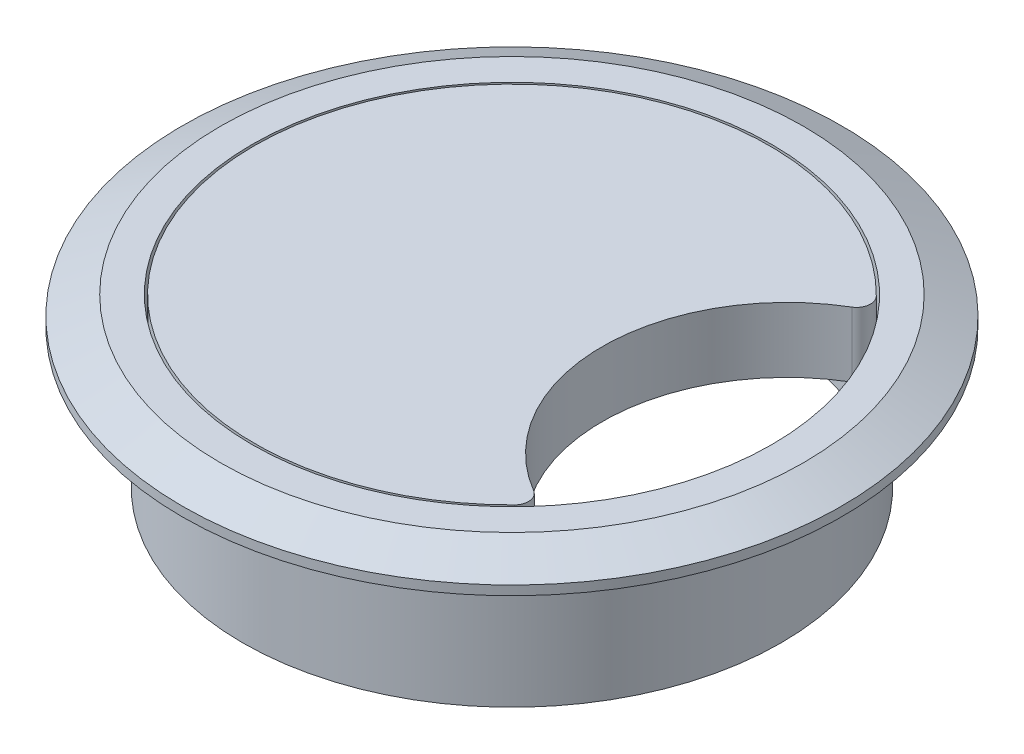
ISO-10303-21;
HEADER;
FILE_DESCRIPTION(('STEP AP214'),'2;1');
FILE_NAME('part.step','',(''),(''),'','','');
FILE_SCHEMA(('AUTOMOTIVE_DESIGN { 1 0 10303 214 1 1 1 1 }'));
ENDSEC;
DATA;
#1=APPLICATION_CONTEXT('core data for automotive mechanical design processes');
#2=APPLICATION_PROTOCOL_DEFINITION('international standard','automotive_design',2000,#1);
#3=PRODUCT_CONTEXT('',#1,'mechanical');
#4=PRODUCT('Part','Part','',(#3));
#5=PRODUCT_RELATED_PRODUCT_CATEGORY('part','',(#4));
#6=PRODUCT_DEFINITION_FORMATION('','',#4);
#7=PRODUCT_DEFINITION_CONTEXT('part definition',#1,'design');
#8=PRODUCT_DEFINITION('design','',#6,#7);
#9=PRODUCT_DEFINITION_SHAPE('','',#8);
#10=(LENGTH_UNIT() NAMED_UNIT(*) SI_UNIT(.MILLI.,.METRE.));
#11=(NAMED_UNIT(*) PLANE_ANGLE_UNIT() SI_UNIT($,.RADIAN.));
#12=(NAMED_UNIT(*) SI_UNIT($,.STERADIAN.) SOLID_ANGLE_UNIT());
#13=UNCERTAINTY_MEASURE_WITH_UNIT(LENGTH_MEASURE(1.E-05),#10,'distance_accuracy_value','');
#14=(GEOMETRIC_REPRESENTATION_CONTEXT(3) GLOBAL_UNCERTAINTY_ASSIGNED_CONTEXT((#13)) GLOBAL_UNIT_ASSIGNED_CONTEXT((#10,
#11,#12)) REPRESENTATION_CONTEXT('',''));
#15=CARTESIAN_POINT('',(0.,0.,0.));
#16=DIRECTION('',(0.,0.,1.));
#17=DIRECTION('',(1.,0.,0.));
#18=AXIS2_PLACEMENT_3D('',#15,#16,#17);
#19=CARTESIAN_POINT('',(29.6411049278792,-4.,0.));
#20=DIRECTION('',(0.,1.,0.));
#21=DIRECTION('',(0.,0.,1.));
#22=AXIS2_PLACEMENT_3D('',#19,#20,#21);
#23=CYLINDRICAL_SURFACE('',#22,19.9235046836858);
#24=CARTESIAN_POINT('',(29.6411049278792,3.,0.));
#25=DIRECTION('',(0.,-1.,0.));
#26=DIRECTION('',(0.,0.,1.));
#27=AXIS2_PLACEMENT_3D('',#24,#25,#26);
#28=CIRCLE('',#27,19.9235046836858);
#29=CARTESIAN_POINT('',(19.472018789832,3.,17.1328843455452));
#30=VERTEX_POINT('',#29);
#31=CARTESIAN_POINT('',(19.4720187898321,3.,-17.1328843455452));
#32=VERTEX_POINT('',#31);
#33=EDGE_CURVE('E85',#30,#32,#28,.T.);
#34=ORIENTED_EDGE('',*,*,#33,.F.);
#35=DIRECTION('',(0.,1.,0.));
#36=VECTOR('',#35,1.);
#37=CARTESIAN_POINT('',(19.472018789832,-4.,17.1328843455452));
#38=LINE('',#37,#36);
#39=CARTESIAN_POINT('',(19.472018789832,-4.,17.1328843455452));
#40=VERTEX_POINT('',#39);
#41=EDGE_CURVE('E61',#30,#40,#38,.F.);
#42=ORIENTED_EDGE('',*,*,#41,.T.);
#43=CARTESIAN_POINT('',(29.6411049278792,-4.,0.));
#44=DIRECTION('',(0.,-1.,0.));
#45=DIRECTION('',(0.,0.,1.));
#46=AXIS2_PLACEMENT_3D('',#43,#44,#45);
#47=CIRCLE('',#46,19.9235046836858);
#48=CARTESIAN_POINT('',(19.4720187898321,-4.,-17.1328843455452));
#49=VERTEX_POINT('',#48);
#50=EDGE_CURVE('E99',#40,#49,#47,.T.);
#51=ORIENTED_EDGE('',*,*,#50,.T.);
#52=DIRECTION('',(0.,1.,0.));
#53=VECTOR('',#52,1.);
#54=CARTESIAN_POINT('',(19.4720187898321,-4.,-17.1328843455452));
#55=LINE('',#54,#53);
#56=EDGE_CURVE('E108',#49,#32,#55,.T.);
#57=ORIENTED_EDGE('',*,*,#56,.T.);
#58=EDGE_LOOP('',(#34,#42,#51,#57));
#59=FACE_BOUND('',#58,.T.);
#60=ADVANCED_FACE('F40',(#59),#23,.F.);
#61=CARTESIAN_POINT('',(0.,-4.,0.));
#62=DIRECTION('',(0.,1.,0.));
#63=DIRECTION('',(0.,0.,1.));
#64=AXIS2_PLACEMENT_3D('',#61,#62,#63);
#65=CYLINDRICAL_SURFACE('',#64,27.7550703412964);
#66=CARTESIAN_POINT('',(0.,-4.,0.));
#67=DIRECTION('',(0.,1.,0.));
#68=DIRECTION('',(0.,0.,1.));
#69=AXIS2_PLACEMENT_3D('',#66,#67,#68);
#70=CIRCLE('',#69,27.7550703412964);
#71=CARTESIAN_POINT('',(19.7751402799119,-4.,-19.4753114624674));
#72=VERTEX_POINT('',#71);
#73=CARTESIAN_POINT('',(19.7751402799119,-4.,19.4753114624674));
#74=VERTEX_POINT('',#73);
#75=EDGE_CURVE('E101',#72,#74,#70,.T.);
#76=ORIENTED_EDGE('',*,*,#75,.T.);
#77=DIRECTION('',(0.,1.,0.));
#78=VECTOR('',#77,1.);
#79=CARTESIAN_POINT('',(19.7751402799119,-4.,19.4753114624674));
#80=LINE('',#79,#78);
#81=CARTESIAN_POINT('',(19.7751402799119,3.,19.4753114624674));
#82=VERTEX_POINT('',#81);
#83=EDGE_CURVE('E91',#74,#82,#80,.T.);
#84=ORIENTED_EDGE('',*,*,#83,.T.);
#85=CARTESIAN_POINT('',(0.,3.,0.));
#86=DIRECTION('',(0.,1.,0.));
#87=DIRECTION('',(0.,0.,1.));
#88=AXIS2_PLACEMENT_3D('',#85,#86,#87);
#89=CIRCLE('',#88,27.7550703412964);
#90=CARTESIAN_POINT('',(19.7751402799119,3.,-19.4753114624674));
#91=VERTEX_POINT('',#90);
#92=EDGE_CURVE('E84',#91,#82,#89,.T.);
#93=ORIENTED_EDGE('',*,*,#92,.F.);
#94=DIRECTION('',(0.,1.,0.));
#95=VECTOR('',#94,1.);
#96=CARTESIAN_POINT('',(19.7751402799119,-4.,-19.4753114624674));
#97=LINE('',#96,#95);
#98=EDGE_CURVE('E97',#91,#72,#97,.F.);
#99=ORIENTED_EDGE('',*,*,#98,.T.);
#100=EDGE_LOOP('',(#76,#84,#93,#99));
#101=FACE_BOUND('',#100,.T.);
#102=ADVANCED_FACE('F96',(#101),#65,.T.);
#103=CARTESIAN_POINT('',(14.8205524639396,-4.,0.));
#104=DIRECTION('',(0.,1.,0.));
#105=DIRECTION('',(0.,0.,1.));
#106=AXIS2_PLACEMENT_3D('',#103,#104,#105);
#107=PLANE('',#106);
#108=ORIENTED_EDGE('',*,*,#50,.F.);
#109=CARTESIAN_POINT('',(18.7064090515233,-4.,18.4227842364695));
#110=DIRECTION('',(0.,1.,0.));
#111=DIRECTION('',(0.,0.,1.));
#112=AXIS2_PLACEMENT_3D('',#109,#110,#111);
#113=CIRCLE('',#112,1.5);
#114=EDGE_CURVE('E12',#40,#74,#113,.F.);
#115=ORIENTED_EDGE('',*,*,#114,.T.);
#116=ORIENTED_EDGE('',*,*,#75,.F.);
#117=CARTESIAN_POINT('',(18.7064090515233,-4.,-18.4227842364695));
#118=DIRECTION('',(0.,1.,0.));
#119=DIRECTION('',(0.,0.,1.));
#120=AXIS2_PLACEMENT_3D('',#117,#118,#119);
#121=CIRCLE('',#120,1.5);
#122=EDGE_CURVE('E48',#72,#49,#121,.F.);
#123=ORIENTED_EDGE('',*,*,#122,.T.);
#124=EDGE_LOOP('',(#108,#115,#116,#123));
#125=FACE_BOUND('',#124,.T.);
#126=ADVANCED_FACE('F112',(#125),#107,.F.);
#127=CARTESIAN_POINT('',(14.8205524639396,3.,0.));
#128=DIRECTION('',(0.,1.,0.));
#129=DIRECTION('',(0.,0.,1.));
#130=AXIS2_PLACEMENT_3D('',#127,#128,#129);
#131=PLANE('',#130);
#132=ORIENTED_EDGE('',*,*,#92,.T.);
#133=CARTESIAN_POINT('',(18.7064090515233,3.,18.4227842364695));
#134=DIRECTION('',(0.,1.,0.));
#135=DIRECTION('',(0.,0.,1.));
#136=AXIS2_PLACEMENT_3D('',#133,#134,#135);
#137=CIRCLE('',#136,1.5);
#138=EDGE_CURVE('E90',#82,#30,#137,.T.);
#139=ORIENTED_EDGE('',*,*,#138,.T.);
#140=ORIENTED_EDGE('',*,*,#33,.T.);
#141=CARTESIAN_POINT('',(18.7064090515233,3.,-18.4227842364695));
#142=DIRECTION('',(0.,1.,0.));
#143=DIRECTION('',(0.,0.,1.));
#144=AXIS2_PLACEMENT_3D('',#141,#142,#143);
#145=CIRCLE('',#144,1.5);
#146=EDGE_CURVE('E81',#32,#91,#145,.T.);
#147=ORIENTED_EDGE('',*,*,#146,.T.);
#148=EDGE_LOOP('',(#132,#139,#140,#147));
#149=FACE_BOUND('',#148,.T.);
#150=ADVANCED_FACE('F83',(#149),#131,.T.);
#151=CARTESIAN_POINT('',(18.7064090515233,-4.,18.4227842364695));
#152=DIRECTION('',(0.,-1.,0.));
#153=DIRECTION('',(0.,0.,-1.));
#154=AXIS2_PLACEMENT_3D('',#151,#152,#153);
#155=CYLINDRICAL_SURFACE('',#154,1.5);
#156=ORIENTED_EDGE('',*,*,#114,.F.);
#157=ORIENTED_EDGE('',*,*,#41,.F.);
#158=ORIENTED_EDGE('',*,*,#138,.F.);
#159=ORIENTED_EDGE('',*,*,#83,.F.);
#160=EDGE_LOOP('',(#156,#157,#158,#159));
#161=FACE_BOUND('',#160,.T.);
#162=ADVANCED_FACE('F114',(#161),#155,.T.);
#163=CARTESIAN_POINT('',(18.7064090515233,-4.,-18.4227842364695));
#164=DIRECTION('',(0.,-1.,0.));
#165=DIRECTION('',(0.,0.,-1.));
#166=AXIS2_PLACEMENT_3D('',#163,#164,#165);
#167=CYLINDRICAL_SURFACE('',#166,1.5);
#168=ORIENTED_EDGE('',*,*,#122,.F.);
#169=ORIENTED_EDGE('',*,*,#98,.F.);
#170=ORIENTED_EDGE('',*,*,#146,.F.);
#171=ORIENTED_EDGE('',*,*,#56,.F.);
#172=EDGE_LOOP('',(#168,#169,#170,#171));
#173=FACE_BOUND('',#172,.T.);
#174=ADVANCED_FACE('F42',(#173),#167,.T.);
#175=CLOSED_SHELL('',(#60,#102,#126,#150,#162,#174));
#176=MANIFOLD_SOLID_BREP('B2',#175);
#177=CARTESIAN_POINT('',(0.,0.,0.));
#178=DIRECTION('',(0.,1.,0.));
#179=DIRECTION('',(0.,0.,1.));
#180=AXIS2_PLACEMENT_3D('',#177,#178,#179);
#181=PLANE('',#180);
#182=CARTESIAN_POINT('',(0.,0.,0.));
#183=DIRECTION('',(0.,1.,0.));
#184=DIRECTION('',(0.,0.,1.));
#185=AXIS2_PLACEMENT_3D('',#182,#183,#184);
#186=CIRCLE('',#185,35.5);
#187=CARTESIAN_POINT('',(0.,0.,35.5));
#188=VERTEX_POINT('',#187);
#189=EDGE_CURVE('E178',#188,#188,#186,.T.);
#190=ORIENTED_EDGE('',*,*,#189,.F.);
#191=EDGE_LOOP('',(#190));
#192=FACE_BOUND('',#191,.T.);
#193=CARTESIAN_POINT('',(0.,0.,0.));
#194=DIRECTION('',(0.,1.,0.));
#195=DIRECTION('',(0.,0.,1.));
#196=AXIS2_PLACEMENT_3D('',#193,#194,#195);
#197=CIRCLE('',#196,29.);
#198=CARTESIAN_POINT('',(0.,0.,29.));
#199=VERTEX_POINT('',#198);
#200=EDGE_CURVE('E39',#199,#199,#197,.F.);
#201=ORIENTED_EDGE('',*,*,#200,.F.);
#202=EDGE_LOOP('',(#201));
#203=FACE_BOUND('',#202,.T.);
#204=ADVANCED_FACE('F163',(#192,#203),#181,.F.);
#205=CARTESIAN_POINT('',(0.,3.,0.));
#206=DIRECTION('',(0.,1.,0.));
#207=DIRECTION('',(0.,0.,1.));
#208=AXIS2_PLACEMENT_3D('',#205,#206,#207);
#209=PLANE('',#208);
#210=CARTESIAN_POINT('',(0.,3.,0.));
#211=DIRECTION('',(0.,1.,0.));
#212=DIRECTION('',(0.,0.,1.));
#213=AXIS2_PLACEMENT_3D('',#210,#211,#212);
#214=CIRCLE('',#213,31.3993923168414);
#215=CARTESIAN_POINT('',(0.,3.,31.3993923168414));
#216=VERTEX_POINT('',#215);
#217=EDGE_CURVE('E174',#216,#216,#214,.T.);
#218=ORIENTED_EDGE('',*,*,#217,.T.);
#219=EDGE_LOOP('',(#218));
#220=FACE_BOUND('',#219,.T.);
#221=CARTESIAN_POINT('',(0.,3.,0.));
#222=DIRECTION('',(0.,1.,0.));
#223=DIRECTION('',(0.,0.,1.));
#224=AXIS2_PLACEMENT_3D('',#221,#222,#223);
#225=CIRCLE('',#224,28.);
#226=CARTESIAN_POINT('',(0.,3.,28.));
#227=VERTEX_POINT('',#226);
#228=EDGE_CURVE('E183',#227,#227,#225,.T.);
#229=ORIENTED_EDGE('',*,*,#228,.F.);
#230=EDGE_LOOP('',(#229));
#231=FACE_BOUND('',#230,.T.);
#232=ADVANCED_FACE('F208',(#220,#231),#209,.T.);
#233=CARTESIAN_POINT('',(0.,3.,0.));
#234=DIRECTION('',(0.,-1.,0.));
#235=DIRECTION('',(0.,0.,-1.));
#236=AXIS2_PLACEMENT_3D('',#233,#234,#235);
#237=CYLINDRICAL_SURFACE('',#236,35.5);
#238=CARTESIAN_POINT('',(0.,1.,0.));
#239=DIRECTION('',(0.,1.,0.));
#240=DIRECTION('',(0.,0.,1.));
#241=AXIS2_PLACEMENT_3D('',#238,#239,#240);
#242=CIRCLE('',#241,35.5);
#243=CARTESIAN_POINT('',(0.,1.,35.5));
#244=VERTEX_POINT('',#243);
#245=EDGE_CURVE('E170',#244,#244,#242,.F.);
#246=ORIENTED_EDGE('',*,*,#245,.T.);
#247=EDGE_LOOP('',(#246));
#248=FACE_BOUND('',#247,.T.);
#249=ORIENTED_EDGE('',*,*,#189,.T.);
#250=EDGE_LOOP('',(#249));
#251=FACE_BOUND('',#250,.T.);
#252=ADVANCED_FACE('F214',(#248,#251),#237,.T.);
#253=CARTESIAN_POINT('',(0.,3.,0.));
#254=DIRECTION('',(0.,-1.,0.));
#255=DIRECTION('',(0.,0.,-1.));
#256=AXIS2_PLACEMENT_3D('',#253,#254,#255);
#257=CYLINDRICAL_SURFACE('',#256,28.);
#258=ORIENTED_EDGE('',*,*,#228,.T.);
#259=EDGE_LOOP('',(#258));
#260=FACE_BOUND('',#259,.T.);
#261=CARTESIAN_POINT('',(0.,-15.,0.));
#262=DIRECTION('',(0.,-1.,0.));
#263=DIRECTION('',(0.,0.,-1.));
#264=AXIS2_PLACEMENT_3D('',#261,#262,#263);
#265=CIRCLE('',#264,28.);
#266=CARTESIAN_POINT('',(0.,-15.,-28.));
#267=VERTEX_POINT('',#266);
#268=EDGE_CURVE('E189',#267,#267,#265,.T.);
#269=ORIENTED_EDGE('',*,*,#268,.T.);
#270=EDGE_LOOP('',(#269));
#271=FACE_BOUND('',#270,.T.);
#272=ADVANCED_FACE('F193',(#260,#271),#257,.F.);
#273=CARTESIAN_POINT('',(0.,3.,0.));
#274=DIRECTION('',(0.,-1.,0.));
#275=DIRECTION('',(0.,0.,-1.));
#276=AXIS2_PLACEMENT_3D('',#273,#274,#275);
#277=CONICAL_SURFACE('',#276,31.3993923168414,1.11701072127637);
#278=ORIENTED_EDGE('',*,*,#245,.F.);
#279=EDGE_LOOP('',(#278));
#280=FACE_BOUND('',#279,.T.);
#281=ORIENTED_EDGE('',*,*,#217,.F.);
#282=EDGE_LOOP('',(#281));
#283=FACE_BOUND('',#282,.T.);
#284=ADVANCED_FACE('F165',(#280,#283),#277,.T.);
#285=CARTESIAN_POINT('',(0.,-15.,0.));
#286=DIRECTION('',(0.,-1.,0.));
#287=DIRECTION('',(0.,0.,-1.));
#288=AXIS2_PLACEMENT_3D('',#285,#286,#287);
#289=PLANE('',#288);
#290=CARTESIAN_POINT('',(0.,-15.,0.));
#291=DIRECTION('',(0.,-1.,0.));
#292=DIRECTION('',(0.,0.,-1.));
#293=AXIS2_PLACEMENT_3D('',#290,#291,#292);
#294=CIRCLE('',#293,29.);
#295=CARTESIAN_POINT('',(0.,-15.,-29.));
#296=VERTEX_POINT('',#295);
#297=EDGE_CURVE('E186',#296,#296,#294,.T.);
#298=ORIENTED_EDGE('',*,*,#297,.T.);
#299=EDGE_LOOP('',(#298));
#300=FACE_BOUND('',#299,.T.);
#301=ORIENTED_EDGE('',*,*,#268,.F.);
#302=EDGE_LOOP('',(#301));
#303=FACE_BOUND('',#302,.T.);
#304=ADVANCED_FACE('F195',(#300,#303),#289,.T.);
#305=CARTESIAN_POINT('',(0.,-15.,0.));
#306=DIRECTION('',(0.,1.,0.));
#307=DIRECTION('',(0.,0.,1.));
#308=AXIS2_PLACEMENT_3D('',#305,#306,#307);
#309=CYLINDRICAL_SURFACE('',#308,29.);
#310=ORIENTED_EDGE('',*,*,#297,.F.);
#311=EDGE_LOOP('',(#310));
#312=FACE_BOUND('',#311,.T.);
#313=ORIENTED_EDGE('',*,*,#200,.T.);
#314=EDGE_LOOP('',(#313));
#315=FACE_BOUND('',#314,.T.);
#316=ADVANCED_FACE('F197',(#312,#315),#309,.T.);
#317=CLOSED_SHELL('',(#204,#232,#252,#272,#284,#304,#316));
#318=MANIFOLD_SOLID_BREP('B6',#317);
#319=ADVANCED_BREP_SHAPE_REPRESENTATION('',(#18,#176,#318),#14);
#320=SHAPE_DEFINITION_REPRESENTATION(#9,#319);
ENDSEC;
END-ISO-10303-21;
